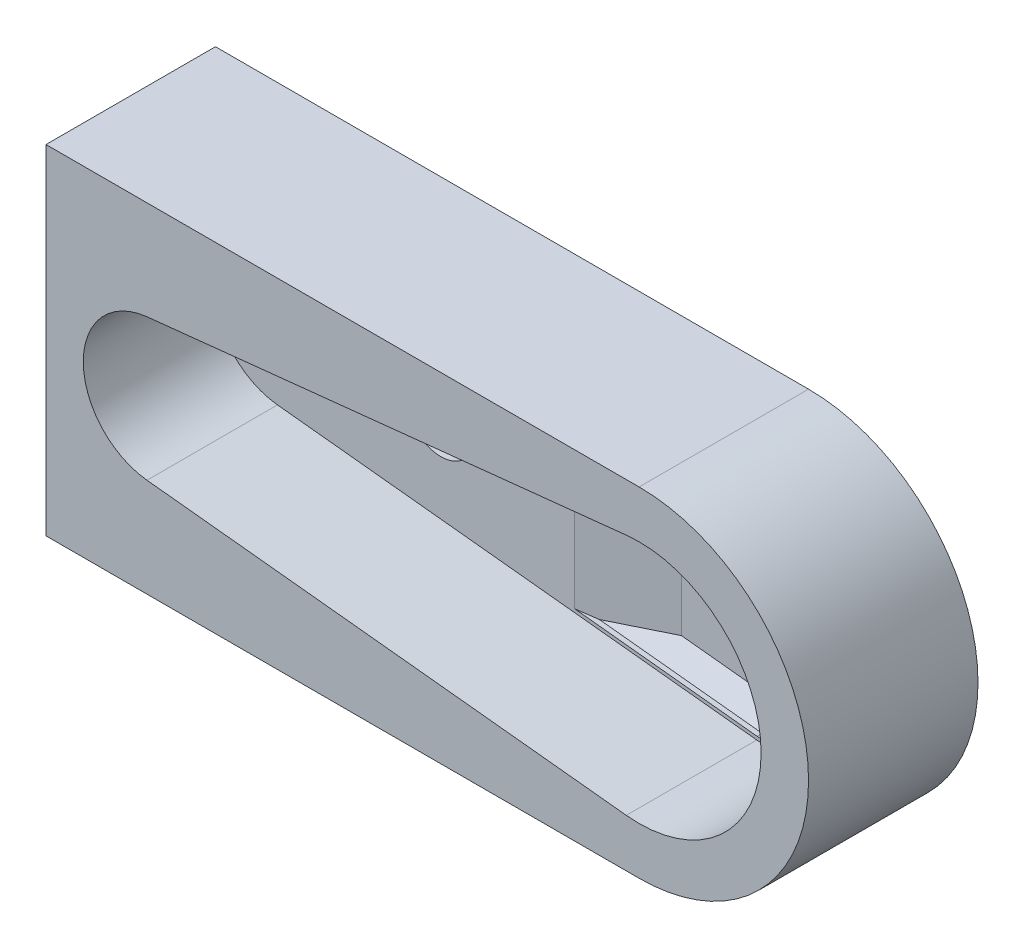
ISO-10303-21;
HEADER;
FILE_DESCRIPTION(('STEP AP214'),'2;1');
FILE_NAME('part.step','',(''),(''),'','','');
FILE_SCHEMA(('AUTOMOTIVE_DESIGN { 1 0 10303 214 1 1 1 1 }'));
ENDSEC;
DATA;
#1=APPLICATION_CONTEXT('core data for automotive mechanical design processes');
#2=APPLICATION_PROTOCOL_DEFINITION('international standard','automotive_design',2000,#1);
#3=PRODUCT_CONTEXT('',#1,'mechanical');
#4=PRODUCT('Part','Part','',(#3));
#5=PRODUCT_RELATED_PRODUCT_CATEGORY('part','',(#4));
#6=PRODUCT_DEFINITION_FORMATION('','',#4);
#7=PRODUCT_DEFINITION_CONTEXT('part definition',#1,'design');
#8=PRODUCT_DEFINITION('design','',#6,#7);
#9=PRODUCT_DEFINITION_SHAPE('','',#8);
#10=(LENGTH_UNIT() NAMED_UNIT(*) SI_UNIT(.MILLI.,.METRE.));
#11=(NAMED_UNIT(*) PLANE_ANGLE_UNIT() SI_UNIT($,.RADIAN.));
#12=(NAMED_UNIT(*) SI_UNIT($,.STERADIAN.) SOLID_ANGLE_UNIT());
#13=UNCERTAINTY_MEASURE_WITH_UNIT(LENGTH_MEASURE(1.E-05),#10,'distance_accuracy_value','');
#14=(GEOMETRIC_REPRESENTATION_CONTEXT(3) GLOBAL_UNCERTAINTY_ASSIGNED_CONTEXT((#13)) GLOBAL_UNIT_ASSIGNED_CONTEXT((#10,
#11,#12)) REPRESENTATION_CONTEXT('',''));
#15=CARTESIAN_POINT('',(0.,0.,0.));
#16=DIRECTION('',(0.,0.,1.));
#17=DIRECTION('',(1.,0.,0.));
#18=AXIS2_PLACEMENT_3D('',#15,#16,#17);
#19=CARTESIAN_POINT('',(27.4734059205451,2.52794836955988,5.59999999999999));
#20=DIRECTION('',(0.,0.,-1.));
#21=DIRECTION('',(1.,0.,0.));
#22=AXIS2_PLACEMENT_3D('',#19,#20,#21);
#23=CYLINDRICAL_SURFACE('',#22,7.00000000000001);
#24=DIRECTION('',(0.,0.,-1.));
#25=VECTOR('',#24,1.);
#26=CARTESIAN_POINT('',(26.7391401862794,-4.43343467057542,5.59999999999999));
#27=LINE('',#26,#25);
#28=CARTESIAN_POINT('',(26.7391401862794,-4.43343467057542,2.29999999999999));
#29=VERTEX_POINT('',#28);
#30=CARTESIAN_POINT('',(26.7391401862794,-4.43343467057542,1.99999999999999));
#31=VERTEX_POINT('',#30);
#32=EDGE_CURVE('E215',#29,#31,#27,.T.);
#33=ORIENTED_EDGE('',*,*,#32,.F.);
#34=CARTESIAN_POINT('',(27.4734059205451,2.52794836955988,2.29999999999999));
#35=DIRECTION('',(0.,0.,1.));
#36=DIRECTION('',(1.,0.,0.));
#37=AXIS2_PLACEMENT_3D('',#34,#35,#36);
#38=CIRCLE('',#37,7.00000000000001);
#39=CARTESIAN_POINT('',(26.7391401862794,9.48933140969517,2.29999999999999));
#40=VERTEX_POINT('',#39);
#41=EDGE_CURVE('E54',#29,#40,#38,.T.);
#42=ORIENTED_EDGE('',*,*,#41,.T.);
#43=DIRECTION('',(0.,0.,-1.));
#44=VECTOR('',#43,1.);
#45=CARTESIAN_POINT('',(26.7391401862794,9.48933140969517,5.59999999999999));
#46=LINE('',#45,#44);
#47=CARTESIAN_POINT('',(26.7391401862794,9.48933140969517,1.99999999999999));
#48=VERTEX_POINT('',#47);
#49=EDGE_CURVE('E218',#40,#48,#46,.T.);
#50=ORIENTED_EDGE('',*,*,#49,.T.);
#51=CARTESIAN_POINT('',(27.4734059205451,2.52794836955988,1.99999999999999));
#52=DIRECTION('',(0.,0.,1.));
#53=DIRECTION('',(-1.,0.,0.));
#54=AXIS2_PLACEMENT_3D('',#51,#52,#53);
#55=CIRCLE('',#54,7.00000000000001);
#56=EDGE_CURVE('E245',#31,#48,#55,.T.);
#57=ORIENTED_EDGE('',*,*,#56,.F.);
#58=EDGE_LOOP('',(#33,#42,#50,#57));
#59=FACE_BOUND('',#58,.T.);
#60=ADVANCED_FACE('F37',(#59),#23,.F.);
#61=CARTESIAN_POINT('',(-1.54617449903532,6.50588153535148,5.59999999999999));
#62=DIRECTION('',(0.104895104895105,-0.994483291447898,0.));
#63=DIRECTION('',(0.994483291447898,0.104895104895105,0.));
#64=AXIS2_PLACEMENT_3D('',#61,#62,#63);
#65=PLANE('',#64);
#66=ORIENTED_EDGE('',*,*,#49,.F.);
#67=DIRECTION('',(-0.994483291447898,-0.104895104895105,0.));
#68=VECTOR('',#67,1.);
#69=CARTESIAN_POINT('',(-1.54617449903532,6.50588153535148,2.29999999999999));
#70=LINE('',#69,#68);
#71=CARTESIAN_POINT('',(15.9734059205452,8.35379415654246,2.29999999999999));
#72=VERTEX_POINT('',#71);
#73=EDGE_CURVE('E201',#40,#72,#70,.T.);
#74=ORIENTED_EDGE('',*,*,#73,.T.);
#75=DIRECTION('',(-0.96281877058011,-0.101555226521639,0.250332880350831));
#76=VECTOR('',#75,1.);
#77=CARTESIAN_POINT('',(-1.2436659665544,6.53778922502221,6.77643869064593));
#78=LINE('',#77,#76);
#79=CARTESIAN_POINT('',(17.1272520743913,8.47549837659455,1.99999999999999));
#80=VERTEX_POINT('',#79);
#81=EDGE_CURVE('E226',#80,#72,#78,.T.);
#82=ORIENTED_EDGE('',*,*,#81,.F.);
#83=DIRECTION('',(-0.994483291447898,-0.104895104895105,0.));
#84=VECTOR('',#83,1.);
#85=CARTESIAN_POINT('',(-1.54617449903532,6.50588153535148,1.99999999999999));
#86=LINE('',#85,#84);
#87=EDGE_CURVE('E236',#48,#80,#86,.T.);
#88=ORIENTED_EDGE('',*,*,#87,.F.);
#89=EDGE_LOOP('',(#66,#74,#82,#88));
#90=FACE_BOUND('',#89,.T.);
#91=ADVANCED_FACE('F309',(#90),#65,.T.);
#92=CARTESIAN_POINT('',(26.7391401862794,-4.43343467057542,5.59999999999999));
#93=DIRECTION('',(0.104895104895105,0.994483291447898,0.));
#94=DIRECTION('',(-0.994483291447898,0.104895104895105,0.));
#95=AXIS2_PLACEMENT_3D('',#92,#93,#94);
#96=PLANE('',#95);
#97=DIRECTION('',(0.96281877058011,-0.101555226521639,-0.250332880350831));
#98=VECTOR('',#97,1.);
#99=CARTESIAN_POINT('',(25.2691056039135,-4.27837984658517,-0.116881917675799));
#100=LINE('',#99,#98);
#101=CARTESIAN_POINT('',(15.9734059205452,-3.29789741742271,2.29999999999999));
#102=VERTEX_POINT('',#101);
#103=CARTESIAN_POINT('',(17.1272520743913,-3.4196016374748,1.99999999999999));
#104=VERTEX_POINT('',#103);
#105=EDGE_CURVE('E223',#102,#104,#100,.T.);
#106=ORIENTED_EDGE('',*,*,#105,.F.);
#107=DIRECTION('',(0.994483291447898,-0.104895104895105,0.));
#108=VECTOR('',#107,1.);
#109=CARTESIAN_POINT('',(26.7391401862794,-4.43343467057542,2.29999999999999));
#110=LINE('',#109,#108);
#111=EDGE_CURVE('E199',#102,#29,#110,.T.);
#112=ORIENTED_EDGE('',*,*,#111,.T.);
#113=ORIENTED_EDGE('',*,*,#32,.T.);
#114=DIRECTION('',(0.994483291447898,-0.104895104895105,0.));
#115=VECTOR('',#114,1.);
#116=CARTESIAN_POINT('',(26.7391401862794,-4.43343467057542,1.99999999999999));
#117=LINE('',#116,#115);
#118=EDGE_CURVE('E242',#104,#31,#117,.T.);
#119=ORIENTED_EDGE('',*,*,#118,.F.);
#120=EDGE_LOOP('',(#106,#112,#113,#119));
#121=FACE_BOUND('',#120,.T.);
#122=ADVANCED_FACE('F305',(#121),#96,.T.);
#123=CARTESIAN_POINT('',(-7.52659407945488,-7.47205163044011,5.5));
#124=DIRECTION('',(0.,1.,0.));
#125=DIRECTION('',(-1.,0.,0.));
#126=AXIS2_PLACEMENT_3D('',#123,#124,#125);
#127=PLANE('',#126);
#128=DIRECTION('',(1.,0.,0.));
#129=VECTOR('',#128,1.);
#130=CARTESIAN_POINT('',(-7.52659407945488,-7.47205163044011,0.));
#131=LINE('',#130,#129);
#132=CARTESIAN_POINT('',(-7.52659407945488,-7.47205163044011,0.));
#133=VERTEX_POINT('',#132);
#134=CARTESIAN_POINT('',(27.4734059205451,-7.47205163044012,0.));
#135=VERTEX_POINT('',#134);
#136=EDGE_CURVE('E262',#133,#135,#131,.T.);
#137=ORIENTED_EDGE('',*,*,#136,.T.);
#138=DIRECTION('',(0.,0.,-1.));
#139=VECTOR('',#138,1.);
#140=CARTESIAN_POINT('',(27.4734059205451,-7.47205163044012,5.5));
#141=LINE('',#140,#139);
#142=CARTESIAN_POINT('',(27.4734059205451,-7.47205163044012,10.));
#143=VERTEX_POINT('',#142);
#144=EDGE_CURVE('E46',#135,#143,#141,.F.);
#145=ORIENTED_EDGE('',*,*,#144,.T.);
#146=DIRECTION('',(1.,0.,0.));
#147=VECTOR('',#146,1.);
#148=CARTESIAN_POINT('',(-7.52659407945488,-7.47205163044011,10.));
#149=LINE('',#148,#147);
#150=CARTESIAN_POINT('',(-7.52659407945488,-7.47205163044011,10.));
#151=VERTEX_POINT('',#150);
#152=EDGE_CURVE('E167',#151,#143,#149,.T.);
#153=ORIENTED_EDGE('',*,*,#152,.F.);
#154=DIRECTION('',(0.,0.,-1.));
#155=VECTOR('',#154,1.);
#156=CARTESIAN_POINT('',(-7.52659407945488,-7.47205163044011,5.5));
#157=LINE('',#156,#155);
#158=EDGE_CURVE('E270',#151,#133,#157,.T.);
#159=ORIENTED_EDGE('',*,*,#158,.T.);
#160=EDGE_LOOP('',(#137,#145,#153,#159));
#161=FACE_BOUND('',#160,.T.);
#162=ADVANCED_FACE('F287',(#161),#127,.F.);
#163=CARTESIAN_POINT('',(-7.52659407945488,12.5279483695599,5.5));
#164=DIRECTION('',(0.,-1.,0.));
#165=DIRECTION('',(0.,0.,-1.));
#166=AXIS2_PLACEMENT_3D('',#163,#164,#165);
#167=PLANE('',#166);
#168=DIRECTION('',(0.,0.,-1.));
#169=VECTOR('',#168,1.);
#170=CARTESIAN_POINT('',(-7.52659407945488,12.5279483695599,5.5));
#171=LINE('',#170,#169);
#172=CARTESIAN_POINT('',(-7.52659407945488,12.5279483695599,10.));
#173=VERTEX_POINT('',#172);
#174=CARTESIAN_POINT('',(-7.52659407945488,12.5279483695599,0.));
#175=VERTEX_POINT('',#174);
#176=EDGE_CURVE('E267',#173,#175,#171,.T.);
#177=ORIENTED_EDGE('',*,*,#176,.F.);
#178=DIRECTION('',(-1.,0.,0.));
#179=VECTOR('',#178,1.);
#180=CARTESIAN_POINT('',(27.4734059205451,12.5279483695599,10.));
#181=LINE('',#180,#179);
#182=CARTESIAN_POINT('',(27.4734059205451,12.5279483695599,10.));
#183=VERTEX_POINT('',#182);
#184=EDGE_CURVE('E180',#183,#173,#181,.T.);
#185=ORIENTED_EDGE('',*,*,#184,.F.);
#186=DIRECTION('',(0.,0.,-1.));
#187=VECTOR('',#186,1.);
#188=CARTESIAN_POINT('',(27.4734059205451,12.5279483695599,5.5));
#189=LINE('',#188,#187);
#190=CARTESIAN_POINT('',(27.4734059205451,12.5279483695599,0.));
#191=VERTEX_POINT('',#190);
#192=EDGE_CURVE('E12',#183,#191,#189,.T.);
#193=ORIENTED_EDGE('',*,*,#192,.T.);
#194=DIRECTION('',(-1.,0.,0.));
#195=VECTOR('',#194,1.);
#196=CARTESIAN_POINT('',(-7.52659407945488,12.5279483695599,0.));
#197=LINE('',#196,#195);
#198=EDGE_CURVE('E265',#191,#175,#197,.T.);
#199=ORIENTED_EDGE('',*,*,#198,.T.);
#200=EDGE_LOOP('',(#177,#185,#193,#199));
#201=FACE_BOUND('',#200,.T.);
#202=ADVANCED_FACE('F298',(#201),#167,.F.);
#203=CARTESIAN_POINT('',(-7.52659407945488,12.5279483695599,5.5));
#204=DIRECTION('',(1.,0.,0.));
#205=DIRECTION('',(0.,0.,-1.));
#206=AXIS2_PLACEMENT_3D('',#203,#204,#205);
#207=PLANE('',#206);
#208=DIRECTION('',(0.,-1.,0.));
#209=VECTOR('',#208,1.);
#210=CARTESIAN_POINT('',(-7.52659407945488,12.5279483695599,0.));
#211=LINE('',#210,#209);
#212=EDGE_CURVE('E259',#175,#133,#211,.T.);
#213=ORIENTED_EDGE('',*,*,#212,.T.);
#214=ORIENTED_EDGE('',*,*,#158,.F.);
#215=DIRECTION('',(0.,-1.,0.));
#216=VECTOR('',#215,1.);
#217=CARTESIAN_POINT('',(-7.52659407945488,12.5279483695599,10.));
#218=LINE('',#217,#216);
#219=EDGE_CURVE('E177',#173,#151,#218,.T.);
#220=ORIENTED_EDGE('',*,*,#219,.F.);
#221=ORIENTED_EDGE('',*,*,#176,.T.);
#222=EDGE_LOOP('',(#213,#214,#220,#221));
#223=FACE_BOUND('',#222,.T.);
#224=ADVANCED_FACE('F292',(#223),#207,.F.);
#225=CARTESIAN_POINT('',(0.,0.,0.));
#226=DIRECTION('',(0.,0.,1.));
#227=DIRECTION('',(1.,0.,0.));
#228=AXIS2_PLACEMENT_3D('',#225,#226,#227);
#229=PLANE('',#228);
#230=CARTESIAN_POINT('',(8.07340592054511,2.52794836955994,0.));
#231=DIRECTION('',(0.,0.,1.));
#232=DIRECTION('',(1.,0.,0.));
#233=AXIS2_PLACEMENT_3D('',#230,#231,#232);
#234=CIRCLE('',#233,2.);
#235=CARTESIAN_POINT('',(10.0734059205451,2.52794836955994,0.));
#236=VERTEX_POINT('',#235);
#237=EDGE_CURVE('E204',#236,#236,#234,.T.);
#238=ORIENTED_EDGE('',*,*,#237,.T.);
#239=EDGE_LOOP('',(#238));
#240=FACE_BOUND('',#239,.T.);
#241=CARTESIAN_POINT('',(-1.52659407945489,2.52794836955988,0.));
#242=DIRECTION('',(0.,0.,1.));
#243=DIRECTION('',(1.,0.,0.));
#244=AXIS2_PLACEMENT_3D('',#241,#242,#243);
#245=CIRCLE('',#244,2.);
#246=CARTESIAN_POINT('',(0.473405920545114,2.52794836955988,0.));
#247=VERTEX_POINT('',#246);
#248=EDGE_CURVE('E208',#247,#247,#245,.T.);
#249=ORIENTED_EDGE('',*,*,#248,.T.);
#250=EDGE_LOOP('',(#249));
#251=FACE_BOUND('',#250,.T.);
#252=CARTESIAN_POINT('',(27.4734059205451,2.52794836955988,0.));
#253=DIRECTION('',(0.,0.,1.));
#254=DIRECTION('',(1.,0.,0.));
#255=AXIS2_PLACEMENT_3D('',#252,#253,#254);
#256=CIRCLE('',#255,4.8);
#257=CARTESIAN_POINT('',(32.2734059205451,2.52794836955988,0.));
#258=VERTEX_POINT('',#257);
#259=EDGE_CURVE('E258',#258,#258,#256,.T.);
#260=ORIENTED_EDGE('',*,*,#259,.T.);
#261=EDGE_LOOP('',(#260));
#262=FACE_BOUND('',#261,.T.);
#263=CARTESIAN_POINT('',(27.4734059205451,2.52794836955989,0.));
#264=DIRECTION('',(0.,0.,1.));
#265=DIRECTION('',(1.,0.,0.));
#266=AXIS2_PLACEMENT_3D('',#263,#264,#265);
#267=CIRCLE('',#266,10.);
#268=CARTESIAN_POINT('',(37.4734059205451,2.52794836955989,0.));
#269=VERTEX_POINT('',#268);
#270=EDGE_CURVE('E273',#191,#269,#267,.F.);
#271=ORIENTED_EDGE('',*,*,#270,.T.);
#272=CARTESIAN_POINT('',(27.4734059205451,2.52794836955988,0.));
#273=DIRECTION('',(0.,0.,1.));
#274=DIRECTION('',(1.,0.,0.));
#275=AXIS2_PLACEMENT_3D('',#272,#273,#274);
#276=CIRCLE('',#275,10.);
#277=EDGE_CURVE('E281',#269,#135,#276,.F.);
#278=ORIENTED_EDGE('',*,*,#277,.T.);
#279=ORIENTED_EDGE('',*,*,#136,.F.);
#280=ORIENTED_EDGE('',*,*,#212,.F.);
#281=ORIENTED_EDGE('',*,*,#198,.F.);
#282=EDGE_LOOP('',(#271,#278,#279,#280,#281));
#283=FACE_BOUND('',#282,.T.);
#284=ADVANCED_FACE('F296',(#240,#251,#262,#283),#229,.F.);
#285=CARTESIAN_POINT('',(27.4734059205451,2.52794836955988,-0.800000000000009));
#286=DIRECTION('',(0.,0.,1.));
#287=DIRECTION('',(-1.,0.,0.));
#288=AXIS2_PLACEMENT_3D('',#285,#286,#287);
#289=CONICAL_SURFACE('',#288,4.,0.785398163397447);
#290=CARTESIAN_POINT('',(27.4734059205451,2.52794836955988,0.699999999999999));
#291=DIRECTION('',(0.,0.,-1.));
#292=DIRECTION('',(1.,0.,0.));
#293=AXIS2_PLACEMENT_3D('',#290,#291,#292);
#294=CIRCLE('',#293,5.5);
#295=CARTESIAN_POINT('',(32.9734059205451,2.52794836955988,0.699999999999999));
#296=VERTEX_POINT('',#295);
#297=EDGE_CURVE('E255',#296,#296,#294,.F.);
#298=ORIENTED_EDGE('',*,*,#297,.T.);
#299=EDGE_LOOP('',(#298));
#300=FACE_BOUND('',#299,.T.);
#301=ORIENTED_EDGE('',*,*,#259,.F.);
#302=EDGE_LOOP('',(#301));
#303=FACE_BOUND('',#302,.T.);
#304=ADVANCED_FACE('F338',(#300,#303),#289,.F.);
#305=CARTESIAN_POINT('',(27.4734059205451,2.52794836955988,2.29999999999999));
#306=DIRECTION('',(0.,0.,1.));
#307=DIRECTION('',(-1.,0.,0.));
#308=AXIS2_PLACEMENT_3D('',#305,#306,#307);
#309=PLANE('',#308);
#310=DIRECTION('',(0.,-1.,0.));
#311=VECTOR('',#310,1.);
#312=CARTESIAN_POINT('',(15.9734059205452,2.52794836955988,2.29999999999999));
#313=LINE('',#312,#311);
#314=EDGE_CURVE('E220',#72,#102,#313,.T.);
#315=ORIENTED_EDGE('',*,*,#314,.F.);
#316=ORIENTED_EDGE('',*,*,#73,.F.);
#317=ORIENTED_EDGE('',*,*,#41,.F.);
#318=ORIENTED_EDGE('',*,*,#111,.F.);
#319=EDGE_LOOP('',(#315,#316,#317,#318));
#320=FACE_BOUND('',#319,.T.);
#321=CARTESIAN_POINT('',(-1.52659407945489,2.52794836955988,2.29999999999999));
#322=DIRECTION('',(0.,0.,1.));
#323=DIRECTION('',(1.,0.,0.));
#324=AXIS2_PLACEMENT_3D('',#321,#322,#323);
#325=CIRCLE('',#324,2.);
#326=CARTESIAN_POINT('',(0.473405920545114,2.52794836955988,2.29999999999999));
#327=VERTEX_POINT('',#326);
#328=EDGE_CURVE('E211',#327,#327,#325,.T.);
#329=ORIENTED_EDGE('',*,*,#328,.F.);
#330=EDGE_LOOP('',(#329));
#331=FACE_BOUND('',#330,.T.);
#332=CARTESIAN_POINT('',(8.07340592054511,2.52794836955994,2.29999999999999));
#333=DIRECTION('',(0.,0.,1.));
#334=DIRECTION('',(1.,0.,0.));
#335=AXIS2_PLACEMENT_3D('',#332,#333,#334);
#336=CIRCLE('',#335,2.);
#337=CARTESIAN_POINT('',(10.0734059205451,2.52794836955994,2.29999999999999));
#338=VERTEX_POINT('',#337);
#339=EDGE_CURVE('E207',#338,#338,#336,.T.);
#340=ORIENTED_EDGE('',*,*,#339,.F.);
#341=EDGE_LOOP('',(#340));
#342=FACE_BOUND('',#341,.T.);
#343=CARTESIAN_POINT('',(27.4734059205451,2.52794836955988,2.29999999999999));
#344=DIRECTION('',(0.,0.,1.));
#345=DIRECTION('',(1.,0.,0.));
#346=AXIS2_PLACEMENT_3D('',#343,#344,#345);
#347=CIRCLE('',#346,7.20000000000001);
#348=CARTESIAN_POINT('',(26.7181611653004,9.68822806798475,2.29999999999999));
#349=VERTEX_POINT('',#348);
#350=CARTESIAN_POINT('',(26.7181611653004,-4.632331328865,2.29999999999999));
#351=VERTEX_POINT('',#350);
#352=EDGE_CURVE('E192',#349,#351,#347,.F.);
#353=ORIENTED_EDGE('',*,*,#352,.F.);
#354=DIRECTION('',(0.994483291447898,0.104895104895105,0.));
#355=VECTOR('',#354,1.);
#356=CARTESIAN_POINT('',(26.7181611653004,9.68822806798475,2.29999999999999));
#357=LINE('',#356,#355);
#358=CARTESIAN_POINT('',(-1.56715352001434,6.70477819364106,2.29999999999999));
#359=VERTEX_POINT('',#358);
#360=EDGE_CURVE('E151',#359,#349,#357,.T.);
#361=ORIENTED_EDGE('',*,*,#360,.F.);
#362=CARTESIAN_POINT('',(-1.12659407945489,2.52794836955988,2.29999999999999));
#363=DIRECTION('',(0.,0.,1.));
#364=DIRECTION('',(1.,0.,0.));
#365=AXIS2_PLACEMENT_3D('',#362,#363,#364);
#366=CIRCLE('',#365,4.20000000000001);
#367=CARTESIAN_POINT('',(-1.56715352001434,-1.6488814545213,2.29999999999999));
#368=VERTEX_POINT('',#367);
#369=EDGE_CURVE('E188',#368,#359,#366,.F.);
#370=ORIENTED_EDGE('',*,*,#369,.F.);
#371=DIRECTION('',(-0.994483291447898,0.104895104895105,0.));
#372=VECTOR('',#371,1.);
#373=CARTESIAN_POINT('',(-1.56715352001434,-1.6488814545213,2.29999999999999));
#374=LINE('',#373,#372);
#375=EDGE_CURVE('E190',#351,#368,#374,.T.);
#376=ORIENTED_EDGE('',*,*,#375,.F.);
#377=EDGE_LOOP('',(#353,#361,#370,#376));
#378=FACE_BOUND('',#377,.T.);
#379=ADVANCED_FACE('F340',(#320,#331,#342,#378),#309,.T.);
#380=CARTESIAN_POINT('',(27.4734059205451,2.52794836955988,0.99999999999999));
#381=DIRECTION('',(0.,0.,1.));
#382=DIRECTION('',(-1.,0.,0.));
#383=AXIS2_PLACEMENT_3D('',#380,#381,#382);
#384=PLANE('',#383);
#385=CARTESIAN_POINT('',(27.4734059205451,2.52794836955988,0.99999999999999));
#386=DIRECTION('',(0.,0.,1.));
#387=DIRECTION('',(-1.,0.,0.));
#388=AXIS2_PLACEMENT_3D('',#385,#386,#387);
#389=CIRCLE('',#388,5.5);
#390=CARTESIAN_POINT('',(21.9734059205451,2.52794836955988,0.99999999999999));
#391=VERTEX_POINT('',#390);
#392=EDGE_CURVE('E248',#391,#391,#389,.F.);
#393=ORIENTED_EDGE('',*,*,#392,.T.);
#394=EDGE_LOOP('',(#393));
#395=FACE_BOUND('',#394,.T.);
#396=DIRECTION('',(0.,1.,0.));
#397=VECTOR('',#396,1.);
#398=CARTESIAN_POINT('',(20.9734059205451,-3.82528237098177,0.99999999999999));
#399=LINE('',#398,#397);
#400=CARTESIAN_POINT('',(20.9734059205451,-2.81973505952914,0.99999999999999));
#401=VERTEX_POINT('',#400);
#402=CARTESIAN_POINT('',(20.9734059205451,7.87563179864889,0.99999999999999));
#403=VERTEX_POINT('',#402);
#404=EDGE_CURVE('E212',#401,#403,#399,.T.);
#405=ORIENTED_EDGE('',*,*,#404,.F.);
#406=DIRECTION('',(-0.994483291447898,0.104895104895105,0.));
#407=VECTOR('',#406,1.);
#408=CARTESIAN_POINT('',(26.8440352911745,-3.43895137912752,0.99999999999999));
#409=LINE('',#408,#407);
#410=CARTESIAN_POINT('',(26.8440352911745,-3.43895137912752,0.99999999999999));
#411=VERTEX_POINT('',#410);
#412=EDGE_CURVE('E231',#411,#401,#409,.T.);
#413=ORIENTED_EDGE('',*,*,#412,.F.);
#414=CARTESIAN_POINT('',(27.4734059205451,2.52794836955988,0.99999999999999));
#415=DIRECTION('',(0.,0.,1.));
#416=DIRECTION('',(-1.,0.,0.));
#417=AXIS2_PLACEMENT_3D('',#414,#415,#416);
#418=CIRCLE('',#417,6.00000000000001);
#419=CARTESIAN_POINT('',(26.8440352911745,8.49484811824727,0.99999999999999));
#420=VERTEX_POINT('',#419);
#421=EDGE_CURVE('E229',#420,#411,#418,.F.);
#422=ORIENTED_EDGE('',*,*,#421,.F.);
#423=DIRECTION('',(0.994483291447898,0.104895104895105,0.));
#424=VECTOR('',#423,1.);
#425=CARTESIAN_POINT('',(26.8440352911745,8.49484811824727,0.99999999999999));
#426=LINE('',#425,#424);
#427=EDGE_CURVE('E233',#403,#420,#426,.T.);
#428=ORIENTED_EDGE('',*,*,#427,.F.);
#429=EDGE_LOOP('',(#405,#413,#422,#428));
#430=FACE_BOUND('',#429,.T.);
#431=ADVANCED_FACE('F324',(#395,#430),#384,.T.);
#432=CARTESIAN_POINT('',(15.9734059205452,2.52794836955988,2.29999999999999));
#433=DIRECTION('',(0.251633851764953,0.,0.967822506788271));
#434=DIRECTION('',(0.,-1.,0.));
#435=AXIS2_PLACEMENT_3D('',#432,#433,#434);
#436=PLANE('',#435);
#437=ORIENTED_EDGE('',*,*,#81,.T.);
#438=ORIENTED_EDGE('',*,*,#314,.T.);
#439=ORIENTED_EDGE('',*,*,#105,.T.);
#440=DIRECTION('',(0.956981538878809,0.149255922629947,-0.248815200108493));
#441=VECTOR('',#440,1.);
#442=CARTESIAN_POINT('',(26.2613626611012,-1.99499724581579,-0.37486875254461));
#443=LINE('',#442,#441);
#444=EDGE_CURVE('E238',#401,#104,#443,.F.);
#445=ORIENTED_EDGE('',*,*,#444,.F.);
#446=ORIENTED_EDGE('',*,*,#404,.T.);
#447=DIRECTION('',(-0.956981538878809,0.149255922629947,0.248815200108493));
#448=VECTOR('',#447,1.);
#449=CARTESIAN_POINT('',(26.2613626611012,7.05089398493554,-0.37486875254461));
#450=LINE('',#449,#448);
#451=EDGE_CURVE('E240',#80,#403,#450,.F.);
#452=ORIENTED_EDGE('',*,*,#451,.F.);
#453=EDGE_LOOP('',(#437,#438,#439,#445,#446,#452));
#454=FACE_BOUND('',#453,.T.);
#455=ADVANCED_FACE('F320',(#454),#436,.T.);
#456=CARTESIAN_POINT('',(26.8440352911745,-3.43895137912752,0.99999999999999));
#457=DIRECTION('',(0.0741720399846028,0.703205879159525,0.707106781186549));
#458=DIRECTION('',(-0.994483291447898,0.104895104895105,0.));
#459=AXIS2_PLACEMENT_3D('',#456,#457,#458);
#460=PLANE('',#459);
#461=ORIENTED_EDGE('',*,*,#444,.T.);
#462=ORIENTED_EDGE('',*,*,#118,.T.);
#463=DIRECTION('',(0.0741720399846031,0.703205879159528,-0.707106781186546));
#464=VECTOR('',#463,1.);
#465=CARTESIAN_POINT('',(26.7391401862794,-4.43343467057542,1.99999999999999));
#466=LINE('',#465,#464);
#467=EDGE_CURVE('E216',#31,#411,#466,.T.);
#468=ORIENTED_EDGE('',*,*,#467,.T.);
#469=ORIENTED_EDGE('',*,*,#412,.T.);
#470=EDGE_LOOP('',(#461,#462,#468,#469));
#471=FACE_BOUND('',#470,.T.);
#472=ADVANCED_FACE('F323',(#471),#460,.T.);
#473=CARTESIAN_POINT('',(27.4734059205451,2.52794836955988,0.99999999999999));
#474=DIRECTION('',(0.,0.,1.));
#475=DIRECTION('',(-1.,0.,0.));
#476=AXIS2_PLACEMENT_3D('',#473,#474,#475);
#477=CONICAL_SURFACE('',#476,6.00000000000001,0.78539816339745);
#478=ORIENTED_EDGE('',*,*,#467,.F.);
#479=ORIENTED_EDGE('',*,*,#56,.T.);
#480=DIRECTION('',(0.074172039984603,-0.703205879159528,-0.707106781186546));
#481=VECTOR('',#480,1.);
#482=CARTESIAN_POINT('',(26.7391401862794,9.48933140969517,1.99999999999999));
#483=LINE('',#482,#481);
#484=EDGE_CURVE('E249',#48,#420,#483,.T.);
#485=ORIENTED_EDGE('',*,*,#484,.T.);
#486=ORIENTED_EDGE('',*,*,#421,.T.);
#487=EDGE_LOOP('',(#478,#479,#485,#486));
#488=FACE_BOUND('',#487,.T.);
#489=ADVANCED_FACE('F330',(#488),#477,.F.);
#490=CARTESIAN_POINT('',(26.8440352911745,8.49484811824727,0.99999999999999));
#491=DIRECTION('',(0.0741720399846027,-0.703205879159525,0.707106781186549));
#492=DIRECTION('',(0.994483291447898,0.104895104895105,0.));
#493=AXIS2_PLACEMENT_3D('',#490,#491,#492);
#494=PLANE('',#493);
#495=ORIENTED_EDGE('',*,*,#451,.T.);
#496=ORIENTED_EDGE('',*,*,#427,.T.);
#497=ORIENTED_EDGE('',*,*,#484,.F.);
#498=ORIENTED_EDGE('',*,*,#87,.T.);
#499=EDGE_LOOP('',(#495,#496,#497,#498));
#500=FACE_BOUND('',#499,.T.);
#501=ADVANCED_FACE('F326',(#500),#494,.T.);
#502=CARTESIAN_POINT('',(27.4734059205451,2.52794836955988,-0.800000000000009));
#503=DIRECTION('',(0.,0.,1.));
#504=DIRECTION('',(-1.,0.,0.));
#505=AXIS2_PLACEMENT_3D('',#502,#503,#504);
#506=CYLINDRICAL_SURFACE('',#505,5.5);
#507=ORIENTED_EDGE('',*,*,#297,.F.);
#508=EDGE_LOOP('',(#507));
#509=FACE_BOUND('',#508,.T.);
#510=ORIENTED_EDGE('',*,*,#392,.F.);
#511=EDGE_LOOP('',(#510));
#512=FACE_BOUND('',#511,.T.);
#513=ADVANCED_FACE('F329',(#509,#512),#506,.F.);
#514=CARTESIAN_POINT('',(-1.52659407945489,2.52794836955988,0.));
#515=DIRECTION('',(0.,0.,1.));
#516=DIRECTION('',(1.,0.,0.));
#517=AXIS2_PLACEMENT_3D('',#514,#515,#516);
#518=CYLINDRICAL_SURFACE('',#517,2.);
#519=ORIENTED_EDGE('',*,*,#328,.T.);
#520=EDGE_LOOP('',(#519));
#521=FACE_BOUND('',#520,.T.);
#522=ORIENTED_EDGE('',*,*,#248,.F.);
#523=EDGE_LOOP('',(#522));
#524=FACE_BOUND('',#523,.T.);
#525=ADVANCED_FACE('F353',(#521,#524),#518,.F.);
#526=CARTESIAN_POINT('',(8.07340592054511,2.52794836955994,0.));
#527=DIRECTION('',(0.,0.,1.));
#528=DIRECTION('',(1.,0.,0.));
#529=AXIS2_PLACEMENT_3D('',#526,#527,#528);
#530=CYLINDRICAL_SURFACE('',#529,2.);
#531=ORIENTED_EDGE('',*,*,#339,.T.);
#532=EDGE_LOOP('',(#531));
#533=FACE_BOUND('',#532,.T.);
#534=ORIENTED_EDGE('',*,*,#237,.F.);
#535=EDGE_LOOP('',(#534));
#536=FACE_BOUND('',#535,.T.);
#537=ADVANCED_FACE('F355',(#533,#536),#530,.F.);
#538=CARTESIAN_POINT('',(27.4734059205451,2.52794836955989,5.5));
#539=DIRECTION('',(0.,0.,-1.));
#540=DIRECTION('',(-1.,0.,0.));
#541=AXIS2_PLACEMENT_3D('',#538,#539,#540);
#542=CYLINDRICAL_SURFACE('',#541,10.);
#543=ORIENTED_EDGE('',*,*,#192,.F.);
#544=CARTESIAN_POINT('',(27.4734059205451,2.52794836955989,10.));
#545=DIRECTION('',(0.,0.,1.));
#546=DIRECTION('',(1.,0.,0.));
#547=AXIS2_PLACEMENT_3D('',#544,#545,#546);
#548=CIRCLE('',#547,10.);
#549=EDGE_CURVE('E183',#143,#183,#548,.T.);
#550=ORIENTED_EDGE('',*,*,#549,.F.);
#551=ORIENTED_EDGE('',*,*,#144,.F.);
#552=ORIENTED_EDGE('',*,*,#277,.F.);
#553=DIRECTION('',(0.,0.,-1.));
#554=VECTOR('',#553,1.);
#555=CARTESIAN_POINT('',(37.4734059205451,2.52794836955989,5.5));
#556=LINE('',#555,#554);
#557=CARTESIAN_POINT('',(37.4734059205451,2.52794836955989,5.5));
#558=VERTEX_POINT('',#557);
#559=EDGE_CURVE('E61',#269,#558,#556,.F.);
#560=ORIENTED_EDGE('',*,*,#559,.T.);
#561=ORIENTED_EDGE('',*,*,#559,.F.);
#562=ORIENTED_EDGE('',*,*,#270,.F.);
#563=EDGE_LOOP('',(#543,#550,#551,#552,#560,#561,#562));
#564=FACE_BOUND('',#563,.T.);
#565=ADVANCED_FACE('F39',(#564),#542,.T.);
#566=CARTESIAN_POINT('',(27.4734059205451,2.52794836955988,-40.2130568178766));
#567=DIRECTION('',(0.,0.,1.));
#568=DIRECTION('',(1.,0.,0.));
#569=AXIS2_PLACEMENT_3D('',#566,#567,#568);
#570=CYLINDRICAL_SURFACE('',#569,7.20000000000001);
#571=ORIENTED_EDGE('',*,*,#352,.T.);
#572=DIRECTION('',(0.,0.,1.));
#573=VECTOR('',#572,1.);
#574=CARTESIAN_POINT('',(26.7181611653004,-4.632331328865,-40.2130568178766));
#575=LINE('',#574,#573);
#576=CARTESIAN_POINT('',(26.7181611653004,-4.632331328865,10.));
#577=VERTEX_POINT('',#576);
#578=EDGE_CURVE('E171',#351,#577,#575,.T.);
#579=ORIENTED_EDGE('',*,*,#578,.T.);
#580=CARTESIAN_POINT('',(27.4734059205451,2.52794836955988,10.));
#581=DIRECTION('',(0.,0.,1.));
#582=DIRECTION('',(1.,0.,0.));
#583=AXIS2_PLACEMENT_3D('',#580,#581,#582);
#584=CIRCLE('',#583,7.20000000000001);
#585=CARTESIAN_POINT('',(26.7181611653004,9.68822806798475,10.));
#586=VERTEX_POINT('',#585);
#587=EDGE_CURVE('E163',#577,#586,#584,.T.);
#588=ORIENTED_EDGE('',*,*,#587,.T.);
#589=DIRECTION('',(0.,0.,1.));
#590=VECTOR('',#589,1.);
#591=CARTESIAN_POINT('',(26.7181611653004,9.68822806798475,-40.2130568178766));
#592=LINE('',#591,#590);
#593=EDGE_CURVE('E145',#349,#586,#592,.T.);
#594=ORIENTED_EDGE('',*,*,#593,.F.);
#595=EDGE_LOOP('',(#571,#579,#588,#594));
#596=FACE_BOUND('',#595,.T.);
#597=ADVANCED_FACE('F169',(#596),#570,.F.);
#598=CARTESIAN_POINT('',(-1.56715352001434,-1.6488814545213,-40.2130568178766));
#599=DIRECTION('',(-0.104895104895105,-0.994483291447898,0.));
#600=DIRECTION('',(0.994483291447898,-0.104895104895105,0.));
#601=AXIS2_PLACEMENT_3D('',#598,#599,#600);
#602=PLANE('',#601);
#603=ORIENTED_EDGE('',*,*,#375,.T.);
#604=DIRECTION('',(0.,0.,1.));
#605=VECTOR('',#604,1.);
#606=CARTESIAN_POINT('',(-1.56715352001434,-1.6488814545213,-40.2130568178766));
#607=LINE('',#606,#605);
#608=CARTESIAN_POINT('',(-1.56715352001434,-1.6488814545213,10.));
#609=VERTEX_POINT('',#608);
#610=EDGE_CURVE('E195',#368,#609,#607,.T.);
#611=ORIENTED_EDGE('',*,*,#610,.T.);
#612=DIRECTION('',(0.994483291447898,-0.104895104895105,0.));
#613=VECTOR('',#612,1.);
#614=CARTESIAN_POINT('',(-1.56715352001434,-1.6488814545213,10.));
#615=LINE('',#614,#613);
#616=EDGE_CURVE('E172',#609,#577,#615,.T.);
#617=ORIENTED_EDGE('',*,*,#616,.T.);
#618=ORIENTED_EDGE('',*,*,#578,.F.);
#619=EDGE_LOOP('',(#603,#611,#617,#618));
#620=FACE_BOUND('',#619,.T.);
#621=ADVANCED_FACE('F401',(#620),#602,.F.);
#622=CARTESIAN_POINT('',(-1.12659407945489,2.52794836955988,-40.2130568178766));
#623=DIRECTION('',(0.,0.,1.));
#624=DIRECTION('',(1.,0.,0.));
#625=AXIS2_PLACEMENT_3D('',#622,#623,#624);
#626=CYLINDRICAL_SURFACE('',#625,4.20000000000001);
#627=ORIENTED_EDGE('',*,*,#369,.T.);
#628=DIRECTION('',(0.,0.,1.));
#629=VECTOR('',#628,1.);
#630=CARTESIAN_POINT('',(-1.56715352001434,6.70477819364106,-40.2130568178766));
#631=LINE('',#630,#629);
#632=CARTESIAN_POINT('',(-1.56715352001434,6.70477819364106,10.));
#633=VERTEX_POINT('',#632);
#634=EDGE_CURVE('E155',#359,#633,#631,.T.);
#635=ORIENTED_EDGE('',*,*,#634,.T.);
#636=CARTESIAN_POINT('',(-1.12659407945489,2.52794836955988,10.));
#637=DIRECTION('',(0.,0.,1.));
#638=DIRECTION('',(1.,0.,0.));
#639=AXIS2_PLACEMENT_3D('',#636,#637,#638);
#640=CIRCLE('',#639,4.20000000000001);
#641=EDGE_CURVE('E166',#633,#609,#640,.T.);
#642=ORIENTED_EDGE('',*,*,#641,.T.);
#643=ORIENTED_EDGE('',*,*,#610,.F.);
#644=EDGE_LOOP('',(#627,#635,#642,#643));
#645=FACE_BOUND('',#644,.T.);
#646=ADVANCED_FACE('F403',(#645),#626,.F.);
#647=CARTESIAN_POINT('',(26.7181611653004,9.68822806798475,-40.2130568178766));
#648=DIRECTION('',(-0.104895104895105,0.994483291447898,0.));
#649=DIRECTION('',(-0.994483291447898,-0.104895104895105,0.));
#650=AXIS2_PLACEMENT_3D('',#647,#648,#649);
#651=PLANE('',#650);
#652=ORIENTED_EDGE('',*,*,#360,.T.);
#653=ORIENTED_EDGE('',*,*,#593,.T.);
#654=DIRECTION('',(-0.994483291447898,-0.104895104895105,0.));
#655=VECTOR('',#654,1.);
#656=CARTESIAN_POINT('',(26.7181611653004,9.68822806798475,10.));
#657=LINE('',#656,#655);
#658=EDGE_CURVE('E149',#586,#633,#657,.T.);
#659=ORIENTED_EDGE('',*,*,#658,.T.);
#660=ORIENTED_EDGE('',*,*,#634,.F.);
#661=EDGE_LOOP('',(#652,#653,#659,#660));
#662=FACE_BOUND('',#661,.T.);
#663=ADVANCED_FACE('F147',(#662),#651,.F.);
#664=CARTESIAN_POINT('',(0.,0.,10.));
#665=DIRECTION('',(0.,0.,1.));
#666=DIRECTION('',(1.,0.,0.));
#667=AXIS2_PLACEMENT_3D('',#664,#665,#666);
#668=PLANE('',#667);
#669=ORIENTED_EDGE('',*,*,#641,.F.);
#670=ORIENTED_EDGE('',*,*,#658,.F.);
#671=ORIENTED_EDGE('',*,*,#587,.F.);
#672=ORIENTED_EDGE('',*,*,#616,.F.);
#673=EDGE_LOOP('',(#669,#670,#671,#672));
#674=FACE_BOUND('',#673,.T.);
#675=ORIENTED_EDGE('',*,*,#219,.T.);
#676=ORIENTED_EDGE('',*,*,#152,.T.);
#677=ORIENTED_EDGE('',*,*,#549,.T.);
#678=ORIENTED_EDGE('',*,*,#184,.T.);
#679=EDGE_LOOP('',(#675,#676,#677,#678));
#680=FACE_BOUND('',#679,.T.);
#681=ADVANCED_FACE('F160',(#674,#680),#668,.T.);
#682=CLOSED_SHELL('',(#60,#91,#122,#162,#202,#224,#284,#304,#379,#431,#455,#472,#489,#501,#513,
#525,#537,#565,#597,#621,#646,#663,#681));
#683=MANIFOLD_SOLID_BREP('B2',#682);
#684=ADVANCED_BREP_SHAPE_REPRESENTATION('',(#18,#683),#14);
#685=SHAPE_DEFINITION_REPRESENTATION(#9,#684);
ENDSEC;
END-ISO-10303-21;
